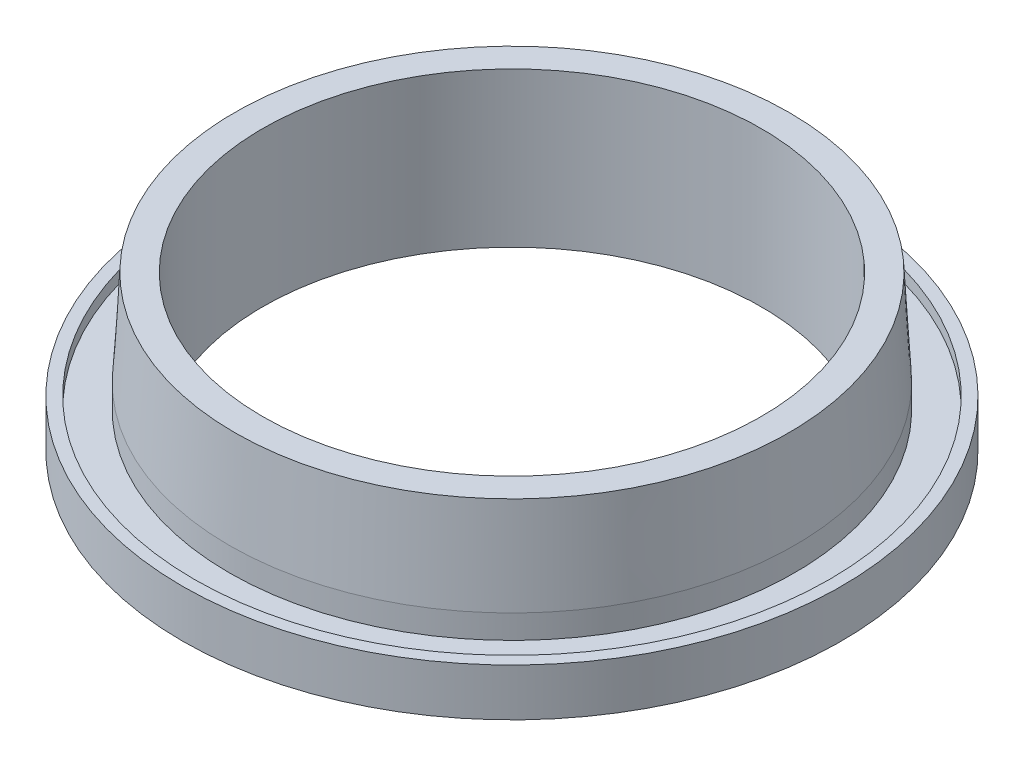
ISO-10303-21;
HEADER;
FILE_DESCRIPTION(('STEP AP214'),'2;1');
FILE_NAME('part.step','',(''),(''),'','','');
FILE_SCHEMA(('AUTOMOTIVE_DESIGN { 1 0 10303 214 1 1 1 1 }'));
ENDSEC;
DATA;
#1=APPLICATION_CONTEXT('core data for automotive mechanical design processes');
#2=APPLICATION_PROTOCOL_DEFINITION('international standard','automotive_design',2000,#1);
#3=PRODUCT_CONTEXT('',#1,'mechanical');
#4=PRODUCT('Part','Part','',(#3));
#5=PRODUCT_RELATED_PRODUCT_CATEGORY('part','',(#4));
#6=PRODUCT_DEFINITION_FORMATION('','',#4);
#7=PRODUCT_DEFINITION_CONTEXT('part definition',#1,'design');
#8=PRODUCT_DEFINITION('design','',#6,#7);
#9=PRODUCT_DEFINITION_SHAPE('','',#8);
#10=(LENGTH_UNIT() NAMED_UNIT(*) SI_UNIT(.MILLI.,.METRE.));
#11=(NAMED_UNIT(*) PLANE_ANGLE_UNIT() SI_UNIT($,.RADIAN.));
#12=(NAMED_UNIT(*) SI_UNIT($,.STERADIAN.) SOLID_ANGLE_UNIT());
#13=UNCERTAINTY_MEASURE_WITH_UNIT(LENGTH_MEASURE(1.E-05),#10,'distance_accuracy_value','');
#14=(GEOMETRIC_REPRESENTATION_CONTEXT(3) GLOBAL_UNCERTAINTY_ASSIGNED_CONTEXT((#13)) GLOBAL_UNIT_ASSIGNED_CONTEXT((#10,
#11,#12)) REPRESENTATION_CONTEXT('',''));
#15=CARTESIAN_POINT('',(0.,0.,0.));
#16=DIRECTION('',(0.,0.,1.));
#17=DIRECTION('',(1.,0.,0.));
#18=AXIS2_PLACEMENT_3D('',#15,#16,#17);
#19=CARTESIAN_POINT('',(0.,2.5,0.));
#20=DIRECTION('',(0.,1.,0.));
#21=DIRECTION('',(0.,0.,1.));
#22=AXIS2_PLACEMENT_3D('',#19,#20,#21);
#23=PLANE('',#22);
#24=CARTESIAN_POINT('',(0.,2.5,0.));
#25=DIRECTION('',(0.,1.,0.));
#26=DIRECTION('',(0.,0.,1.));
#27=AXIS2_PLACEMENT_3D('',#24,#25,#26);
#28=CIRCLE('',#27,69.375);
#29=CARTESIAN_POINT('',(0.,2.5,69.375));
#30=VERTEX_POINT('',#29);
#31=EDGE_CURVE('E56',#30,#30,#28,.T.);
#32=ORIENTED_EDGE('',*,*,#31,.T.);
#33=EDGE_LOOP('',(#32));
#34=FACE_BOUND('',#33,.T.);
#35=CARTESIAN_POINT('',(0.,2.5,0.));
#36=DIRECTION('',(0.,1.,0.));
#37=DIRECTION('',(0.,0.,1.));
#38=AXIS2_PLACEMENT_3D('',#35,#36,#37);
#39=CIRCLE('',#38,66.875);
#40=CARTESIAN_POINT('',(0.,2.5,66.875));
#41=VERTEX_POINT('',#40);
#42=EDGE_CURVE('E62',#41,#41,#39,.T.);
#43=ORIENTED_EDGE('',*,*,#42,.F.);
#44=EDGE_LOOP('',(#43));
#45=FACE_BOUND('',#44,.T.);
#46=ADVANCED_FACE('F41',(#34,#45),#23,.T.);
#47=CARTESIAN_POINT('',(0.,2.5,0.));
#48=DIRECTION('',(0.,-1.,0.));
#49=DIRECTION('',(0.,0.,-1.));
#50=AXIS2_PLACEMENT_3D('',#47,#48,#49);
#51=CYLINDRICAL_SURFACE('',#50,69.375);
#52=ORIENTED_EDGE('',*,*,#31,.F.);
#53=EDGE_LOOP('',(#52));
#54=FACE_BOUND('',#53,.T.);
#55=CARTESIAN_POINT('',(0.,-7.5,0.));
#56=DIRECTION('',(0.,1.,0.));
#57=DIRECTION('',(0.,0.,1.));
#58=AXIS2_PLACEMENT_3D('',#55,#56,#57);
#59=CIRCLE('',#58,69.375);
#60=CARTESIAN_POINT('',(0.,-7.5,69.375));
#61=VERTEX_POINT('',#60);
#62=EDGE_CURVE('E67',#61,#61,#59,.T.);
#63=ORIENTED_EDGE('',*,*,#62,.T.);
#64=EDGE_LOOP('',(#63));
#65=FACE_BOUND('',#64,.T.);
#66=ADVANCED_FACE('F104',(#54,#65),#51,.T.);
#67=CARTESIAN_POINT('',(0.,2.5,0.));
#68=DIRECTION('',(0.,-1.,0.));
#69=DIRECTION('',(0.,0.,-1.));
#70=AXIS2_PLACEMENT_3D('',#67,#68,#69);
#71=CYLINDRICAL_SURFACE('',#70,66.875);
#72=ORIENTED_EDGE('',*,*,#42,.T.);
#73=EDGE_LOOP('',(#72));
#74=FACE_BOUND('',#73,.T.);
#75=CARTESIAN_POINT('',(0.,0.,0.));
#76=DIRECTION('',(0.,1.,0.));
#77=DIRECTION('',(0.,0.,1.));
#78=AXIS2_PLACEMENT_3D('',#75,#76,#77);
#79=CIRCLE('',#78,66.875);
#80=CARTESIAN_POINT('',(0.,0.,66.875));
#81=VERTEX_POINT('',#80);
#82=EDGE_CURVE('E63',#81,#81,#79,.T.);
#83=ORIENTED_EDGE('',*,*,#82,.F.);
#84=EDGE_LOOP('',(#83));
#85=FACE_BOUND('',#84,.T.);
#86=ADVANCED_FACE('F110',(#74,#85),#71,.F.);
#87=CARTESIAN_POINT('',(0.,0.,0.));
#88=DIRECTION('',(0.,1.,0.));
#89=DIRECTION('',(0.,0.,1.));
#90=AXIS2_PLACEMENT_3D('',#87,#88,#89);
#91=PLANE('',#90);
#92=CARTESIAN_POINT('',(0.,0.,0.));
#93=DIRECTION('',(0.,1.,0.));
#94=DIRECTION('',(0.,0.,1.));
#95=AXIS2_PLACEMENT_3D('',#92,#93,#94);
#96=CIRCLE('',#95,59.5);
#97=CARTESIAN_POINT('',(0.,0.,59.5));
#98=VERTEX_POINT('',#97);
#99=EDGE_CURVE('E74',#98,#98,#96,.T.);
#100=ORIENTED_EDGE('',*,*,#99,.F.);
#101=EDGE_LOOP('',(#100));
#102=FACE_BOUND('',#101,.T.);
#103=ORIENTED_EDGE('',*,*,#82,.T.);
#104=EDGE_LOOP('',(#103));
#105=FACE_BOUND('',#104,.T.);
#106=ADVANCED_FACE('F116',(#102,#105),#91,.T.);
#107=CARTESIAN_POINT('',(0.,-7.5,0.));
#108=DIRECTION('',(0.,1.,0.));
#109=DIRECTION('',(0.,0.,1.));
#110=AXIS2_PLACEMENT_3D('',#107,#108,#109);
#111=PLANE('',#110);
#112=CARTESIAN_POINT('',(0.,-7.5,0.));
#113=DIRECTION('',(0.,1.,0.));
#114=DIRECTION('',(0.,0.,1.));
#115=AXIS2_PLACEMENT_3D('',#112,#113,#114);
#116=CIRCLE('',#115,52.5);
#117=CARTESIAN_POINT('',(0.,-7.5,52.5));
#118=VERTEX_POINT('',#117);
#119=EDGE_CURVE('E78',#118,#118,#116,.T.);
#120=ORIENTED_EDGE('',*,*,#119,.T.);
#121=EDGE_LOOP('',(#120));
#122=FACE_BOUND('',#121,.T.);
#123=ORIENTED_EDGE('',*,*,#62,.F.);
#124=EDGE_LOOP('',(#123));
#125=FACE_BOUND('',#124,.T.);
#126=ADVANCED_FACE('F120',(#122,#125),#111,.F.);
#127=CARTESIAN_POINT('',(0.,25.,0.));
#128=DIRECTION('',(0.,-1.,0.));
#129=DIRECTION('',(0.,0.,-1.));
#130=AXIS2_PLACEMENT_3D('',#127,#128,#129);
#131=CYLINDRICAL_SURFACE('',#130,59.5);
#132=CARTESIAN_POINT('',(0.,4.99999999999457,0.));
#133=DIRECTION('',(0.,1.,0.));
#134=DIRECTION('',(0.,0.,1.));
#135=AXIS2_PLACEMENT_3D('',#132,#133,#134);
#136=CIRCLE('',#135,59.5);
#137=CARTESIAN_POINT('',(0.,4.99999999999457,-59.5));
#138=VERTEX_POINT('',#137);
#139=EDGE_CURVE('E10',#138,#138,#136,.F.);
#140=ORIENTED_EDGE('',*,*,#139,.T.);
#141=EDGE_LOOP('',(#140));
#142=FACE_BOUND('',#141,.T.);
#143=ORIENTED_EDGE('',*,*,#99,.T.);
#144=EDGE_LOOP('',(#143));
#145=FACE_BOUND('',#144,.T.);
#146=ADVANCED_FACE('F93',(#142,#145),#131,.T.);
#147=CARTESIAN_POINT('',(0.,25.,0.));
#148=DIRECTION('',(0.,1.,0.));
#149=DIRECTION('',(0.,0.,1.));
#150=AXIS2_PLACEMENT_3D('',#147,#148,#149);
#151=PLANE('',#150);
#152=CARTESIAN_POINT('',(0.,25.,0.));
#153=DIRECTION('',(0.,1.,0.));
#154=DIRECTION('',(0.,0.,1.));
#155=AXIS2_PLACEMENT_3D('',#152,#153,#154);
#156=CIRCLE('',#155,52.5);
#157=CARTESIAN_POINT('',(0.,25.,52.5));
#158=VERTEX_POINT('',#157);
#159=EDGE_CURVE('E46',#158,#158,#156,.T.);
#160=ORIENTED_EDGE('',*,*,#159,.F.);
#161=EDGE_LOOP('',(#160));
#162=FACE_BOUND('',#161,.T.);
#163=CARTESIAN_POINT('',(0.,25.,0.));
#164=DIRECTION('',(0.,1.,0.));
#165=DIRECTION('',(0.,0.,1.));
#166=AXIS2_PLACEMENT_3D('',#163,#164,#165);
#167=CIRCLE('',#166,58.3643176974475);
#168=CARTESIAN_POINT('',(0.,25.,-58.3643176974475));
#169=VERTEX_POINT('',#168);
#170=EDGE_CURVE('E51',#169,#169,#167,.T.);
#171=ORIENTED_EDGE('',*,*,#170,.T.);
#172=EDGE_LOOP('',(#171));
#173=FACE_BOUND('',#172,.T.);
#174=ADVANCED_FACE('F90',(#162,#173),#151,.T.);
#175=CARTESIAN_POINT('',(0.,25.,0.));
#176=DIRECTION('',(0.,-1.,0.));
#177=DIRECTION('',(0.,0.,-1.));
#178=AXIS2_PLACEMENT_3D('',#175,#176,#177);
#179=CONICAL_SURFACE('',#178,58.3643176974475,0.0567232006898116);
#180=CARTESIAN_POINT('',(0.,4.99999999999457,-59.5));
#181=CARTESIAN_POINT('',(0.,5.20833333332796,-59.4881699760151));
#182=CARTESIAN_POINT('',(0.,5.41666666666135,-59.4763399520302));
#183=CARTESIAN_POINT('',(0.,5.83333333332813,-59.4526799040603));
#184=CARTESIAN_POINT('',(0.,6.04166666666152,-59.4408498800754));
#185=CARTESIAN_POINT('',(0.,6.4583333333283,-59.4171898321055));
#186=CARTESIAN_POINT('',(0.,6.66666666666169,-59.4053598081206));
#187=CARTESIAN_POINT('',(0.,7.08333333332847,-59.3816997601508));
#188=CARTESIAN_POINT('',(0.,7.29166666666186,-59.3698697361659));
#189=CARTESIAN_POINT('',(0.,7.70833333332864,-59.346209688196));
#190=CARTESIAN_POINT('',(0.,7.91666666666203,-59.3343796642111));
#191=CARTESIAN_POINT('',(0.,8.33333333332881,-59.3107196162413));
#192=CARTESIAN_POINT('',(0.,8.5416666666622,-59.2988895922563));
#193=CARTESIAN_POINT('',(0.,8.95833333332898,-59.2752295442865));
#194=CARTESIAN_POINT('',(0.,9.16666666666237,-59.2633995203016));
#195=CARTESIAN_POINT('',(0.,9.58333333332915,-59.2397394723317));
#196=CARTESIAN_POINT('',(0.,9.79166666666254,-59.2279094483468));
#197=CARTESIAN_POINT('',(0.,10.2083333333293,-59.204249400377));
#198=CARTESIAN_POINT('',(0.,10.4166666666627,-59.192419376392));
#199=CARTESIAN_POINT('',(0.,10.8333333333295,-59.1687593284222));
#200=CARTESIAN_POINT('',(0.,11.0416666666629,-59.1569293044373));
#201=CARTESIAN_POINT('',(0.,11.4583333333297,-59.1332692564674));
#202=CARTESIAN_POINT('',(0.,11.666666666663,-59.1214392324825));
#203=CARTESIAN_POINT('',(0.,12.0833333333298,-59.0977791845127));
#204=CARTESIAN_POINT('',(0.,12.2916666666632,-59.0859491605277));
#205=CARTESIAN_POINT('',(0.,12.70833333333,-59.0622891125579));
#206=CARTESIAN_POINT('',(0.,12.9166666666634,-59.050459088573));
#207=CARTESIAN_POINT('',(0.,13.3333333333302,-59.0267990406031));
#208=CARTESIAN_POINT('',(0.,13.5416666666636,-59.0149690166182));
#209=CARTESIAN_POINT('',(0.,13.9583333333303,-58.9913089686484));
#210=CARTESIAN_POINT('',(0.,14.1666666666637,-58.9794789446635));
#211=CARTESIAN_POINT('',(0.,14.5833333333305,-58.9558188966936));
#212=CARTESIAN_POINT('',(0.,14.7916666666639,-58.9439888727087));
#213=CARTESIAN_POINT('',(0.,15.2083333333307,-58.9203288247388));
#214=CARTESIAN_POINT('',(0.,15.4166666666641,-58.9084988007539));
#215=CARTESIAN_POINT('',(0.,15.8333333333308,-58.8848387527841));
#216=CARTESIAN_POINT('',(0.,16.0416666666642,-58.8730087287992));
#217=CARTESIAN_POINT('',(0.,16.458333333331,-58.8493486808293));
#218=CARTESIAN_POINT('',(0.,16.6666666666644,-58.8375186568444));
#219=CARTESIAN_POINT('',(0.,17.0833333333312,-58.8138586088745));
#220=CARTESIAN_POINT('',(0.,17.2916666666646,-58.8020285848896));
#221=CARTESIAN_POINT('',(0.,17.7083333333314,-58.7783685369198));
#222=CARTESIAN_POINT('',(0.,17.9166666666647,-58.7665385129349));
#223=CARTESIAN_POINT('',(0.,18.3333333333315,-58.742878464965));
#224=CARTESIAN_POINT('',(0.,18.5416666666649,-58.7310484409801));
#225=CARTESIAN_POINT('',(0.,18.9583333333317,-58.7073883930103));
#226=CARTESIAN_POINT('',(0.,19.1666666666651,-58.6955583690253));
#227=CARTESIAN_POINT('',(0.,19.5833333333319,-58.6718983210555));
#228=CARTESIAN_POINT('',(0.,19.7916666666653,-58.6600682970706));
#229=CARTESIAN_POINT('',(0.,20.208333333332,-58.6364082491007));
#230=CARTESIAN_POINT('',(0.,20.4166666666654,-58.6245782251158));
#231=CARTESIAN_POINT('',(0.,20.8333333333322,-58.600918177146));
#232=CARTESIAN_POINT('',(0.,21.0416666666656,-58.589088153161));
#233=CARTESIAN_POINT('',(0.,21.4583333333324,-58.5654281051912));
#234=CARTESIAN_POINT('',(0.,21.6666666666658,-58.5535980812063));
#235=CARTESIAN_POINT('',(0.,22.0833333333325,-58.5299380332364));
#236=CARTESIAN_POINT('',(0.,22.2916666666659,-58.5181080092515));
#237=CARTESIAN_POINT('',(0.,22.7083333333327,-58.4944479612817));
#238=CARTESIAN_POINT('',(0.,22.9166666666661,-58.4826179372967));
#239=CARTESIAN_POINT('',(0.,23.3333333333329,-58.4589578893269));
#240=CARTESIAN_POINT('',(0.,23.5416666666663,-58.447127865342));
#241=CARTESIAN_POINT('',(0.,23.958333333333,-58.4234678173721));
#242=CARTESIAN_POINT('',(0.,24.1666666666664,-58.4116377933872));
#243=CARTESIAN_POINT('',(0.,24.5833333333332,-58.3879777454174));
#244=CARTESIAN_POINT('',(0.,24.7916666666666,-58.3761477214325));
#245=CARTESIAN_POINT('',(0.,25.,-58.3643176974475));
#246=B_SPLINE_CURVE_WITH_KNOTS('',3,(#180,#181,#182,#183,#184,#185,#186,#187,#188,#189,#190,
#191,#192,#193,#194,#195,#196,#197,#198,#199,#200,#201,#202,#203,#204,#205,#206,#207,#208,#209,
#210,#211,#212,#213,#214,#215,#216,#217,#218,#219,#220,#221,#222,#223,#224,#225,#226,#227,#228,
#229,#230,#231,#232,#233,#234,#235,#236,#237,#238,#239,#240,#241,#242,#243,#244,#245),
.UNSPECIFIED.,.F.,.F.,(4,2,2,2,2,2,2,2,2,2,2,2,2,2,2,2,2,2,2,2,2,2,2,2,2,2,2,2,2,2,2,2,4),(0.,
0.626006825208454,1.25201365041691,1.87802047562536,2.50402730083381,3.13003412604227,
3.75604095125072,4.38204777645917,5.00805460166762,5.63406142687608,6.26006825208453,
6.88607507729298,7.51208190250143,8.13808872770989,8.76409555291834,9.39010237812679,
10.0161092033352,10.6421160285437,11.2681228537522,11.8941296789606,12.5201365041691,
13.1461433293775,13.772150154586,14.3981569797944,15.0241638050029,15.6501706302113,
16.2761774554198,16.9021842806282,17.5281911058367,18.1541979310451,18.7802047562536,
19.406211581462,20.0322184066705),.UNSPECIFIED.);
#247=EDGE_CURVE('BSEAM44',#138,#169,#246,.T.);
#248=ORIENTED_EDGE('',*,*,#139,.F.);
#249=ORIENTED_EDGE('',*,*,#170,.F.);
#250=ORIENTED_EDGE('',*,*,#247,.T.);
#251=ORIENTED_EDGE('',*,*,#247,.F.);
#252=EDGE_LOOP('',(#248,#250,#249,#251));
#253=FACE_BOUND('',#252,.T.);
#254=ADVANCED_FACE('F44',(#253),#179,.T.);
#255=CARTESIAN_POINT('',(0.,-7.5,0.));
#256=DIRECTION('',(0.,1.,0.));
#257=DIRECTION('',(0.,0.,1.));
#258=AXIS2_PLACEMENT_3D('',#255,#256,#257);
#259=CYLINDRICAL_SURFACE('',#258,52.5);
#260=ORIENTED_EDGE('',*,*,#159,.T.);
#261=EDGE_LOOP('',(#260));
#262=FACE_BOUND('',#261,.T.);
#263=ORIENTED_EDGE('',*,*,#119,.F.);
#264=EDGE_LOOP('',(#263));
#265=FACE_BOUND('',#264,.T.);
#266=ADVANCED_FACE('F87',(#262,#265),#259,.F.);
#267=CLOSED_SHELL('',(#46,#66,#86,#106,#126,#146,#174,#254,#266));
#268=MANIFOLD_SOLID_BREP('B2',#267);
#269=ADVANCED_BREP_SHAPE_REPRESENTATION('',(#18,#268),#14);
#270=SHAPE_DEFINITION_REPRESENTATION(#9,#269);
ENDSEC;
END-ISO-10303-21;
